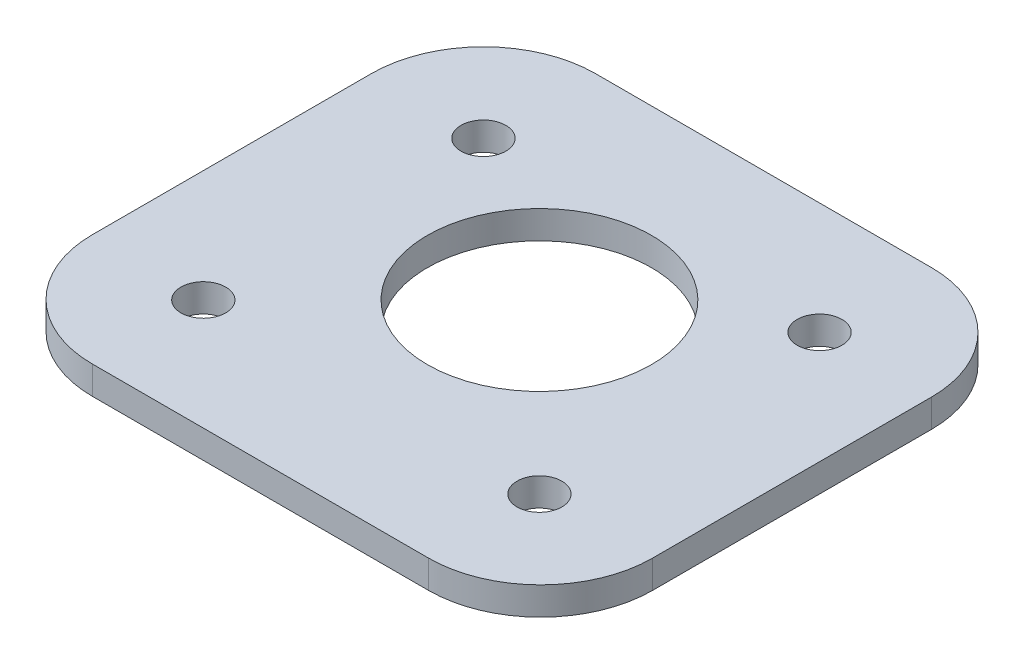
ISO-10303-21;
HEADER;
FILE_DESCRIPTION(('STEP AP214'),'2;1');
FILE_NAME('part.step','',(''),(''),'','','');
FILE_SCHEMA(('AUTOMOTIVE_DESIGN { 1 0 10303 214 1 1 1 1 }'));
ENDSEC;
DATA;
#1=APPLICATION_CONTEXT('core data for automotive mechanical design processes');
#2=APPLICATION_PROTOCOL_DEFINITION('international standard','automotive_design',2000,#1);
#3=PRODUCT_CONTEXT('',#1,'mechanical');
#4=PRODUCT('Part','Part','',(#3));
#5=PRODUCT_RELATED_PRODUCT_CATEGORY('part','',(#4));
#6=PRODUCT_DEFINITION_FORMATION('','',#4);
#7=PRODUCT_DEFINITION_CONTEXT('part definition',#1,'design');
#8=PRODUCT_DEFINITION('design','',#6,#7);
#9=PRODUCT_DEFINITION_SHAPE('','',#8);
#10=(LENGTH_UNIT() NAMED_UNIT(*) SI_UNIT(.MILLI.,.METRE.));
#11=(NAMED_UNIT(*) PLANE_ANGLE_UNIT() SI_UNIT($,.RADIAN.));
#12=(NAMED_UNIT(*) SI_UNIT($,.STERADIAN.) SOLID_ANGLE_UNIT());
#13=UNCERTAINTY_MEASURE_WITH_UNIT(LENGTH_MEASURE(1.E-05),#10,'distance_accuracy_value','');
#14=(GEOMETRIC_REPRESENTATION_CONTEXT(3) GLOBAL_UNCERTAINTY_ASSIGNED_CONTEXT((#13)) GLOBAL_UNIT_ASSIGNED_CONTEXT((#10,
#11,#12)) REPRESENTATION_CONTEXT('',''));
#15=CARTESIAN_POINT('',(0.,0.,0.));
#16=DIRECTION('',(0.,0.,1.));
#17=DIRECTION('',(1.,0.,0.));
#18=AXIS2_PLACEMENT_3D('',#15,#16,#17);
#19=CARTESIAN_POINT('',(63.5,9.525,0.));
#20=DIRECTION('',(1.,0.,0.));
#21=DIRECTION('',(0.,0.,-1.));
#22=AXIS2_PLACEMENT_3D('',#19,#20,#21);
#23=PLANE('',#22);
#24=DIRECTION('',(0.,-1.,0.));
#25=VECTOR('',#24,1.);
#26=CARTESIAN_POINT('',(63.5,9.525,9.7090579710145));
#27=LINE('',#26,#25);
#28=CARTESIAN_POINT('',(63.5,0.,9.7090579710145));
#29=VERTEX_POINT('',#28);
#30=CARTESIAN_POINT('',(63.5,3.175,9.7090579710145));
#31=VERTEX_POINT('',#30);
#32=EDGE_CURVE('E135',#29,#31,#27,.F.);
#33=ORIENTED_EDGE('',*,*,#32,.T.);
#34=DIRECTION('',(0.,0.,-1.));
#35=VECTOR('',#34,1.);
#36=CARTESIAN_POINT('',(63.5,3.175,41.3320579710145));
#37=LINE('',#36,#35);
#38=CARTESIAN_POINT('',(63.5,3.175,41.3320579710145));
#39=VERTEX_POINT('',#38);
#40=EDGE_CURVE('E188',#39,#31,#37,.T.);
#41=ORIENTED_EDGE('',*,*,#40,.F.);
#42=DIRECTION('',(0.,-1.,0.));
#43=VECTOR('',#42,1.);
#44=CARTESIAN_POINT('',(63.5,9.525,41.3320579710145));
#45=LINE('',#44,#43);
#46=CARTESIAN_POINT('',(63.5,0.,41.3320579710145));
#47=VERTEX_POINT('',#46);
#48=EDGE_CURVE('E128',#39,#47,#45,.T.);
#49=ORIENTED_EDGE('',*,*,#48,.T.);
#50=DIRECTION('',(0.,0.,1.));
#51=VECTOR('',#50,1.);
#52=CARTESIAN_POINT('',(63.5,0.,0.));
#53=LINE('',#52,#51);
#54=EDGE_CURVE('E146',#29,#47,#53,.T.);
#55=ORIENTED_EDGE('',*,*,#54,.F.);
#56=EDGE_LOOP('',(#33,#41,#49,#55));
#57=FACE_BOUND('',#56,.T.);
#58=ADVANCED_FACE('F40',(#57),#23,.T.);
#59=CARTESIAN_POINT('',(0.,9.525,0.));
#60=DIRECTION('',(1.,0.,0.));
#61=DIRECTION('',(0.,0.,-1.));
#62=AXIS2_PLACEMENT_3D('',#59,#60,#61);
#63=PLANE('',#62);
#64=DIRECTION('',(0.,0.,1.));
#65=VECTOR('',#64,1.);
#66=CARTESIAN_POINT('',(0.,3.175,9.7090579710145));
#67=LINE('',#66,#65);
#68=CARTESIAN_POINT('',(0.,3.175,9.7090579710145));
#69=VERTEX_POINT('',#68);
#70=CARTESIAN_POINT('',(0.,3.175,41.3320579710145));
#71=VERTEX_POINT('',#70);
#72=EDGE_CURVE('E55',#69,#71,#67,.T.);
#73=ORIENTED_EDGE('',*,*,#72,.F.);
#74=DIRECTION('',(0.,-1.,0.));
#75=VECTOR('',#74,1.);
#76=CARTESIAN_POINT('',(0.,0.,9.7090579710145));
#77=LINE('',#76,#75);
#78=CARTESIAN_POINT('',(0.,0.,9.7090579710145));
#79=VERTEX_POINT('',#78);
#80=EDGE_CURVE('E138',#69,#79,#77,.T.);
#81=ORIENTED_EDGE('',*,*,#80,.T.);
#82=DIRECTION('',(0.,0.,1.));
#83=VECTOR('',#82,1.);
#84=CARTESIAN_POINT('',(0.,0.,0.));
#85=LINE('',#84,#83);
#86=CARTESIAN_POINT('',(0.,0.,41.3320579710145));
#87=VERTEX_POINT('',#86);
#88=EDGE_CURVE('E144',#79,#87,#85,.T.);
#89=ORIENTED_EDGE('',*,*,#88,.T.);
#90=DIRECTION('',(0.,1.,0.));
#91=VECTOR('',#90,1.);
#92=CARTESIAN_POINT('',(0.,9.525,41.3320579710145));
#93=LINE('',#92,#91);
#94=EDGE_CURVE('E11',#87,#71,#93,.T.);
#95=ORIENTED_EDGE('',*,*,#94,.T.);
#96=EDGE_LOOP('',(#73,#81,#89,#95));
#97=FACE_BOUND('',#96,.T.);
#98=ADVANCED_FACE('F206',(#97),#63,.F.);
#99=CARTESIAN_POINT('',(0.,9.525,-2.99094202898549));
#100=DIRECTION('',(0.,0.,-1.));
#101=DIRECTION('',(-1.,0.,0.));
#102=AXIS2_PLACEMENT_3D('',#99,#100,#101);
#103=PLANE('',#102);
#104=DIRECTION('',(0.,-1.,0.));
#105=VECTOR('',#104,1.);
#106=CARTESIAN_POINT('',(12.7,9.525,-2.99094202898549));
#107=LINE('',#106,#105);
#108=CARTESIAN_POINT('',(12.7,0.,-2.99094202898549));
#109=VERTEX_POINT('',#108);
#110=CARTESIAN_POINT('',(12.7,3.175,-2.99094202898549));
#111=VERTEX_POINT('',#110);
#112=EDGE_CURVE('E130',#109,#111,#107,.F.);
#113=ORIENTED_EDGE('',*,*,#112,.T.);
#114=DIRECTION('',(-1.,0.,0.));
#115=VECTOR('',#114,1.);
#116=CARTESIAN_POINT('',(50.8,3.175,-2.99094202898549));
#117=LINE('',#116,#115);
#118=CARTESIAN_POINT('',(50.8,3.175,-2.99094202898549));
#119=VERTEX_POINT('',#118);
#120=EDGE_CURVE('E184',#119,#111,#117,.T.);
#121=ORIENTED_EDGE('',*,*,#120,.F.);
#122=DIRECTION('',(0.,-1.,0.));
#123=VECTOR('',#122,1.);
#124=CARTESIAN_POINT('',(50.8,9.525,-2.99094202898549));
#125=LINE('',#124,#123);
#126=CARTESIAN_POINT('',(50.8,0.,-2.99094202898549));
#127=VERTEX_POINT('',#126);
#128=EDGE_CURVE('E133',#119,#127,#125,.T.);
#129=ORIENTED_EDGE('',*,*,#128,.T.);
#130=DIRECTION('',(1.,0.,0.));
#131=VECTOR('',#130,1.);
#132=CARTESIAN_POINT('',(0.,0.,-2.99094202898549));
#133=LINE('',#132,#131);
#134=EDGE_CURVE('E149',#109,#127,#133,.T.);
#135=ORIENTED_EDGE('',*,*,#134,.F.);
#136=EDGE_LOOP('',(#113,#121,#129,#135));
#137=FACE_BOUND('',#136,.T.);
#138=ADVANCED_FACE('F212',(#137),#103,.T.);
#139=CARTESIAN_POINT('',(12.7,9.525,9.7090579710145));
#140=DIRECTION('',(0.,1.,0.));
#141=DIRECTION('',(0.,0.,1.));
#142=AXIS2_PLACEMENT_3D('',#139,#140,#141);
#143=CYLINDRICAL_SURFACE('',#142,12.7);
#144=ORIENTED_EDGE('',*,*,#80,.F.);
#145=CARTESIAN_POINT('',(12.7,3.175,9.7090579710145));
#146=DIRECTION('',(0.,1.,0.));
#147=DIRECTION('',(0.,0.,1.));
#148=AXIS2_PLACEMENT_3D('',#145,#146,#147);
#149=CIRCLE('',#148,12.7);
#150=EDGE_CURVE('E182',#111,#69,#149,.T.);
#151=ORIENTED_EDGE('',*,*,#150,.F.);
#152=ORIENTED_EDGE('',*,*,#112,.F.);
#153=CARTESIAN_POINT('',(12.7,0.,9.7090579710145));
#154=DIRECTION('',(0.,1.,0.));
#155=DIRECTION('',(0.,0.,1.));
#156=AXIS2_PLACEMENT_3D('',#153,#154,#155);
#157=CIRCLE('',#156,12.7);
#158=EDGE_CURVE('E140',#79,#109,#157,.F.);
#159=ORIENTED_EDGE('',*,*,#158,.F.);
#160=EDGE_LOOP('',(#144,#151,#152,#159));
#161=FACE_BOUND('',#160,.T.);
#162=ADVANCED_FACE('F216',(#161),#143,.T.);
#163=CARTESIAN_POINT('',(50.8,9.525,9.7090579710145));
#164=DIRECTION('',(0.,-1.,0.));
#165=DIRECTION('',(0.,0.,-1.));
#166=AXIS2_PLACEMENT_3D('',#163,#164,#165);
#167=CYLINDRICAL_SURFACE('',#166,12.7);
#168=ORIENTED_EDGE('',*,*,#128,.F.);
#169=CARTESIAN_POINT('',(50.8,3.175,9.7090579710145));
#170=DIRECTION('',(0.,1.,0.));
#171=DIRECTION('',(0.,0.,1.));
#172=AXIS2_PLACEMENT_3D('',#169,#170,#171);
#173=CIRCLE('',#172,12.7);
#174=EDGE_CURVE('E186',#31,#119,#173,.T.);
#175=ORIENTED_EDGE('',*,*,#174,.F.);
#176=ORIENTED_EDGE('',*,*,#32,.F.);
#177=CARTESIAN_POINT('',(50.8,0.,9.7090579710145));
#178=DIRECTION('',(0.,1.,0.));
#179=DIRECTION('',(0.,0.,1.));
#180=AXIS2_PLACEMENT_3D('',#177,#178,#179);
#181=CIRCLE('',#180,12.7);
#182=EDGE_CURVE('E142',#127,#29,#181,.F.);
#183=ORIENTED_EDGE('',*,*,#182,.F.);
#184=EDGE_LOOP('',(#168,#175,#176,#183));
#185=FACE_BOUND('',#184,.T.);
#186=ADVANCED_FACE('F219',(#185),#167,.T.);
#187=CARTESIAN_POINT('',(12.7,9.525,41.4590579710145));
#188=DIRECTION('',(0.,-1.,0.));
#189=DIRECTION('',(0.,0.,-1.));
#190=AXIS2_PLACEMENT_3D('',#187,#188,#189);
#191=CYLINDRICAL_SURFACE('',#190,2.54);
#192=CARTESIAN_POINT('',(12.7,0.,41.4590579710145));
#193=DIRECTION('',(0.,-1.,0.));
#194=DIRECTION('',(0.,0.,-1.));
#195=AXIS2_PLACEMENT_3D('',#192,#193,#194);
#196=CIRCLE('',#195,2.54);
#197=CARTESIAN_POINT('',(12.7,0.,38.9190579710145));
#198=VERTEX_POINT('',#197);
#199=EDGE_CURVE('E152',#198,#198,#196,.T.);
#200=CARTESIAN_POINT('',(12.7,3.175,41.4590579710145));
#201=DIRECTION('',(0.,1.,0.));
#202=DIRECTION('',(0.,0.,1.));
#203=AXIS2_PLACEMENT_3D('',#200,#201,#202);
#204=CIRCLE('',#203,2.54);
#205=CARTESIAN_POINT('',(12.7,3.175,38.9190579710145));
#206=VERTEX_POINT('',#205);
#207=EDGE_CURVE('E169',#206,#206,#204,.F.);
#208=CARTESIAN_POINT('',(12.7,0.,38.9190579710145));
#209=CARTESIAN_POINT('',(12.7,0.0330729166666665,38.9190579710145));
#210=CARTESIAN_POINT('',(12.7,0.066145833333333,38.9190579710145));
#211=CARTESIAN_POINT('',(12.7,0.132291666666667,38.9190579710145));
#212=CARTESIAN_POINT('',(12.7,0.165364583333334,38.9190579710145));
#213=CARTESIAN_POINT('',(12.7,0.231510416666667,38.9190579710145));
#214=CARTESIAN_POINT('',(12.7,0.264583333333334,38.9190579710145));
#215=CARTESIAN_POINT('',(12.7,0.330729166666667,38.9190579710145));
#216=CARTESIAN_POINT('',(12.7,0.363802083333333,38.9190579710145));
#217=CARTESIAN_POINT('',(12.7,0.429947916666667,38.9190579710145));
#218=CARTESIAN_POINT('',(12.7,0.463020833333334,38.9190579710145));
#219=CARTESIAN_POINT('',(12.7,0.529166666666667,38.9190579710145));
#220=CARTESIAN_POINT('',(12.7,0.562239583333334,38.9190579710145));
#221=CARTESIAN_POINT('',(12.7,0.628385416666667,38.9190579710145));
#222=CARTESIAN_POINT('',(12.7,0.661458333333333,38.9190579710145));
#223=CARTESIAN_POINT('',(12.7,0.727604166666666,38.9190579710145));
#224=CARTESIAN_POINT('',(12.7,0.760677083333333,38.9190579710145));
#225=CARTESIAN_POINT('',(12.7,0.826822916666666,38.9190579710145));
#226=CARTESIAN_POINT('',(12.7,0.859895833333334,38.9190579710145));
#227=CARTESIAN_POINT('',(12.7,0.926041666666667,38.9190579710145));
#228=CARTESIAN_POINT('',(12.7,0.959114583333334,38.9190579710145));
#229=CARTESIAN_POINT('',(12.7,1.02526041666667,38.9190579710145));
#230=CARTESIAN_POINT('',(12.7,1.05833333333333,38.9190579710145));
#231=CARTESIAN_POINT('',(12.7,1.12447916666667,38.9190579710145));
#232=CARTESIAN_POINT('',(12.7,1.15755208333333,38.9190579710145));
#233=CARTESIAN_POINT('',(12.7,1.22369791666667,38.9190579710145));
#234=CARTESIAN_POINT('',(12.7,1.25677083333333,38.9190579710145));
#235=CARTESIAN_POINT('',(12.7,1.32291666666667,38.9190579710145));
#236=CARTESIAN_POINT('',(12.7,1.35598958333333,38.9190579710145));
#237=CARTESIAN_POINT('',(12.7,1.42213541666667,38.9190579710145));
#238=CARTESIAN_POINT('',(12.7,1.45520833333333,38.9190579710145));
#239=CARTESIAN_POINT('',(12.7,1.52135416666667,38.9190579710145));
#240=CARTESIAN_POINT('',(12.7,1.55442708333333,38.9190579710145));
#241=CARTESIAN_POINT('',(12.7,1.62057291666667,38.9190579710145));
#242=CARTESIAN_POINT('',(12.7,1.65364583333333,38.9190579710145));
#243=CARTESIAN_POINT('',(12.7,1.71979166666667,38.9190579710145));
#244=CARTESIAN_POINT('',(12.7,1.75286458333333,38.9190579710145));
#245=CARTESIAN_POINT('',(12.7,1.81901041666667,38.9190579710145));
#246=CARTESIAN_POINT('',(12.7,1.85208333333333,38.9190579710145));
#247=CARTESIAN_POINT('',(12.7,1.91822916666667,38.9190579710145));
#248=CARTESIAN_POINT('',(12.7,1.95130208333333,38.9190579710145));
#249=CARTESIAN_POINT('',(12.7,2.01744791666667,38.9190579710145));
#250=CARTESIAN_POINT('',(12.7,2.05052083333333,38.9190579710145));
#251=CARTESIAN_POINT('',(12.7,2.11666666666667,38.9190579710145));
#252=CARTESIAN_POINT('',(12.7,2.14973958333333,38.9190579710145));
#253=CARTESIAN_POINT('',(12.7,2.21588541666667,38.9190579710145));
#254=CARTESIAN_POINT('',(12.7,2.24895833333333,38.9190579710145));
#255=CARTESIAN_POINT('',(12.7,2.31510416666667,38.9190579710145));
#256=CARTESIAN_POINT('',(12.7,2.34817708333333,38.9190579710145));
#257=CARTESIAN_POINT('',(12.7,2.41432291666667,38.9190579710145));
#258=CARTESIAN_POINT('',(12.7,2.44739583333333,38.9190579710145));
#259=CARTESIAN_POINT('',(12.7,2.51354166666667,38.9190579710145));
#260=CARTESIAN_POINT('',(12.7,2.54661458333333,38.9190579710145));
#261=CARTESIAN_POINT('',(12.7,2.61276041666667,38.9190579710145));
#262=CARTESIAN_POINT('',(12.7,2.64583333333333,38.9190579710145));
#263=CARTESIAN_POINT('',(12.7,2.71197916666667,38.9190579710145));
#264=CARTESIAN_POINT('',(12.7,2.74505208333333,38.9190579710145));
#265=CARTESIAN_POINT('',(12.7,2.81119791666667,38.9190579710145));
#266=CARTESIAN_POINT('',(12.7,2.84427083333333,38.9190579710145));
#267=CARTESIAN_POINT('',(12.7,2.91041666666667,38.9190579710145));
#268=CARTESIAN_POINT('',(12.7,2.94348958333333,38.9190579710145));
#269=CARTESIAN_POINT('',(12.7,3.00963541666667,38.9190579710145));
#270=CARTESIAN_POINT('',(12.7,3.04270833333333,38.9190579710145));
#271=CARTESIAN_POINT('',(12.7,3.10885416666667,38.9190579710145));
#272=CARTESIAN_POINT('',(12.7,3.14192708333333,38.9190579710145));
#273=CARTESIAN_POINT('',(12.7,3.175,38.9190579710145));
#274=B_SPLINE_CURVE_WITH_KNOTS('',3,(#208,#209,#210,#211,#212,#213,#214,#215,#216,#217,#218,
#219,#220,#221,#222,#223,#224,#225,#226,#227,#228,#229,#230,#231,#232,#233,#234,#235,#236,#237,
#238,#239,#240,#241,#242,#243,#244,#245,#246,#247,#248,#249,#250,#251,#252,#253,#254,#255,#256,
#257,#258,#259,#260,#261,#262,#263,#264,#265,#266,#267,#268,#269,#270,#271,#272,#273),
.UNSPECIFIED.,.F.,.F.,(4,2,2,2,2,2,2,2,2,2,2,2,2,2,2,2,2,2,2,2,2,2,2,2,2,2,2,2,2,2,2,2,4),(0.,
0.0992187499999995,0.198437500000001,0.29765625,0.396875,0.496093750000001,0.5953125,0.69453125,
0.793749999999999,0.892968750000001,0.9921875,1.09140625,1.190625,1.28984375,1.3890625,
1.48828125,1.5875,1.68671875,1.7859375,1.88515625,1.984375,2.08359375,2.1828125,2.28203125,
2.38125,2.48046875,2.5796875,2.67890625,2.778125,2.87734375,2.9765625,3.07578125,3.175),.UNSPECIFIED.);
#275=EDGE_CURVE('BSEAM222',#198,#206,#274,.T.);
#276=ORIENTED_EDGE('',*,*,#199,.T.);
#277=ORIENTED_EDGE('',*,*,#207,.F.);
#278=ORIENTED_EDGE('',*,*,#275,.T.);
#279=ORIENTED_EDGE('',*,*,#275,.F.);
#280=EDGE_LOOP('',(#276,#278,#277,#279));
#281=FACE_BOUND('',#280,.T.);
#282=ADVANCED_FACE('F222',(#281),#191,.F.);
#283=CARTESIAN_POINT('',(50.8,9.525,41.4590579710145));
#284=DIRECTION('',(0.,-1.,0.));
#285=DIRECTION('',(0.,0.,-1.));
#286=AXIS2_PLACEMENT_3D('',#283,#284,#285);
#287=CYLINDRICAL_SURFACE('',#286,2.54);
#288=CARTESIAN_POINT('',(50.8,0.,41.4590579710145));
#289=DIRECTION('',(0.,-1.,0.));
#290=DIRECTION('',(0.,0.,-1.));
#291=AXIS2_PLACEMENT_3D('',#288,#289,#290);
#292=CIRCLE('',#291,2.54);
#293=CARTESIAN_POINT('',(50.8,0.,38.9190579710145));
#294=VERTEX_POINT('',#293);
#295=EDGE_CURVE('E155',#294,#294,#292,.T.);
#296=CARTESIAN_POINT('',(50.8,3.175,41.4590579710145));
#297=DIRECTION('',(0.,1.,0.));
#298=DIRECTION('',(0.,0.,1.));
#299=AXIS2_PLACEMENT_3D('',#296,#297,#298);
#300=CIRCLE('',#299,2.54);
#301=CARTESIAN_POINT('',(50.8,3.175,38.9190579710145));
#302=VERTEX_POINT('',#301);
#303=EDGE_CURVE('E172',#302,#302,#300,.F.);
#304=CARTESIAN_POINT('',(50.8,0.,38.9190579710145));
#305=CARTESIAN_POINT('',(50.8,0.0330729166666665,38.9190579710145));
#306=CARTESIAN_POINT('',(50.8,0.066145833333333,38.9190579710145));
#307=CARTESIAN_POINT('',(50.8,0.132291666666667,38.9190579710145));
#308=CARTESIAN_POINT('',(50.8,0.165364583333334,38.9190579710145));
#309=CARTESIAN_POINT('',(50.8,0.231510416666667,38.9190579710145));
#310=CARTESIAN_POINT('',(50.8,0.264583333333334,38.9190579710145));
#311=CARTESIAN_POINT('',(50.8,0.330729166666667,38.9190579710145));
#312=CARTESIAN_POINT('',(50.8,0.363802083333333,38.9190579710145));
#313=CARTESIAN_POINT('',(50.8,0.429947916666667,38.9190579710145));
#314=CARTESIAN_POINT('',(50.8,0.463020833333334,38.9190579710145));
#315=CARTESIAN_POINT('',(50.8,0.529166666666667,38.9190579710145));
#316=CARTESIAN_POINT('',(50.8,0.562239583333334,38.9190579710145));
#317=CARTESIAN_POINT('',(50.8,0.628385416666667,38.9190579710145));
#318=CARTESIAN_POINT('',(50.8,0.661458333333333,38.9190579710145));
#319=CARTESIAN_POINT('',(50.8,0.727604166666666,38.9190579710145));
#320=CARTESIAN_POINT('',(50.8,0.760677083333333,38.9190579710145));
#321=CARTESIAN_POINT('',(50.8,0.826822916666666,38.9190579710145));
#322=CARTESIAN_POINT('',(50.8,0.859895833333334,38.9190579710145));
#323=CARTESIAN_POINT('',(50.8,0.926041666666667,38.9190579710145));
#324=CARTESIAN_POINT('',(50.8,0.959114583333334,38.9190579710145));
#325=CARTESIAN_POINT('',(50.8,1.02526041666667,38.9190579710145));
#326=CARTESIAN_POINT('',(50.8,1.05833333333333,38.9190579710145));
#327=CARTESIAN_POINT('',(50.8,1.12447916666667,38.9190579710145));
#328=CARTESIAN_POINT('',(50.8,1.15755208333333,38.9190579710145));
#329=CARTESIAN_POINT('',(50.8,1.22369791666667,38.9190579710145));
#330=CARTESIAN_POINT('',(50.8,1.25677083333333,38.9190579710145));
#331=CARTESIAN_POINT('',(50.8,1.32291666666667,38.9190579710145));
#332=CARTESIAN_POINT('',(50.8,1.35598958333333,38.9190579710145));
#333=CARTESIAN_POINT('',(50.8,1.42213541666667,38.9190579710145));
#334=CARTESIAN_POINT('',(50.8,1.45520833333333,38.9190579710145));
#335=CARTESIAN_POINT('',(50.8,1.52135416666667,38.9190579710145));
#336=CARTESIAN_POINT('',(50.8,1.55442708333333,38.9190579710145));
#337=CARTESIAN_POINT('',(50.8,1.62057291666667,38.9190579710145));
#338=CARTESIAN_POINT('',(50.8,1.65364583333333,38.9190579710145));
#339=CARTESIAN_POINT('',(50.8,1.71979166666667,38.9190579710145));
#340=CARTESIAN_POINT('',(50.8,1.75286458333333,38.9190579710145));
#341=CARTESIAN_POINT('',(50.8,1.81901041666667,38.9190579710145));
#342=CARTESIAN_POINT('',(50.8,1.85208333333333,38.9190579710145));
#343=CARTESIAN_POINT('',(50.8,1.91822916666667,38.9190579710145));
#344=CARTESIAN_POINT('',(50.8,1.95130208333333,38.9190579710145));
#345=CARTESIAN_POINT('',(50.8,2.01744791666667,38.9190579710145));
#346=CARTESIAN_POINT('',(50.8,2.05052083333333,38.9190579710145));
#347=CARTESIAN_POINT('',(50.8,2.11666666666667,38.9190579710145));
#348=CARTESIAN_POINT('',(50.8,2.14973958333333,38.9190579710145));
#349=CARTESIAN_POINT('',(50.8,2.21588541666667,38.9190579710145));
#350=CARTESIAN_POINT('',(50.8,2.24895833333333,38.9190579710145));
#351=CARTESIAN_POINT('',(50.8,2.31510416666667,38.9190579710145));
#352=CARTESIAN_POINT('',(50.8,2.34817708333333,38.9190579710145));
#353=CARTESIAN_POINT('',(50.8,2.41432291666667,38.9190579710145));
#354=CARTESIAN_POINT('',(50.8,2.44739583333333,38.9190579710145));
#355=CARTESIAN_POINT('',(50.8,2.51354166666667,38.9190579710145));
#356=CARTESIAN_POINT('',(50.8,2.54661458333333,38.9190579710145));
#357=CARTESIAN_POINT('',(50.8,2.61276041666667,38.9190579710145));
#358=CARTESIAN_POINT('',(50.8,2.64583333333333,38.9190579710145));
#359=CARTESIAN_POINT('',(50.8,2.71197916666667,38.9190579710145));
#360=CARTESIAN_POINT('',(50.8,2.74505208333333,38.9190579710145));
#361=CARTESIAN_POINT('',(50.8,2.81119791666667,38.9190579710145));
#362=CARTESIAN_POINT('',(50.8,2.84427083333333,38.9190579710145));
#363=CARTESIAN_POINT('',(50.8,2.91041666666667,38.9190579710145));
#364=CARTESIAN_POINT('',(50.8,2.94348958333333,38.9190579710145));
#365=CARTESIAN_POINT('',(50.8,3.00963541666667,38.9190579710145));
#366=CARTESIAN_POINT('',(50.8,3.04270833333333,38.9190579710145));
#367=CARTESIAN_POINT('',(50.8,3.10885416666667,38.9190579710145));
#368=CARTESIAN_POINT('',(50.8,3.14192708333333,38.9190579710145));
#369=CARTESIAN_POINT('',(50.8,3.175,38.9190579710145));
#370=B_SPLINE_CURVE_WITH_KNOTS('',3,(#304,#305,#306,#307,#308,#309,#310,#311,#312,#313,#314,
#315,#316,#317,#318,#319,#320,#321,#322,#323,#324,#325,#326,#327,#328,#329,#330,#331,#332,#333,
#334,#335,#336,#337,#338,#339,#340,#341,#342,#343,#344,#345,#346,#347,#348,#349,#350,#351,#352,
#353,#354,#355,#356,#357,#358,#359,#360,#361,#362,#363,#364,#365,#366,#367,#368,#369),
.UNSPECIFIED.,.F.,.F.,(4,2,2,2,2,2,2,2,2,2,2,2,2,2,2,2,2,2,2,2,2,2,2,2,2,2,2,2,2,2,2,2,4),(0.,
0.0992187499999995,0.198437500000001,0.29765625,0.396875,0.496093750000001,0.5953125,0.69453125,
0.793749999999999,0.892968750000001,0.9921875,1.09140625,1.190625,1.28984375,1.3890625,
1.48828125,1.5875,1.68671875,1.7859375,1.88515625,1.984375,2.08359375,2.1828125,2.28203125,
2.38125,2.48046875,2.5796875,2.67890625,2.778125,2.87734375,2.9765625,3.07578125,3.175),.UNSPECIFIED.);
#371=EDGE_CURVE('BSEAM255',#294,#302,#370,.T.);
#372=ORIENTED_EDGE('',*,*,#295,.T.);
#373=ORIENTED_EDGE('',*,*,#303,.F.);
#374=ORIENTED_EDGE('',*,*,#371,.T.);
#375=ORIENTED_EDGE('',*,*,#371,.F.);
#376=EDGE_LOOP('',(#372,#374,#373,#375));
#377=FACE_BOUND('',#376,.T.);
#378=ADVANCED_FACE('F255',(#377),#287,.F.);
#379=CARTESIAN_POINT('',(50.8,9.525,9.7090579710145));
#380=DIRECTION('',(0.,-1.,0.));
#381=DIRECTION('',(0.,0.,-1.));
#382=AXIS2_PLACEMENT_3D('',#379,#380,#381);
#383=CYLINDRICAL_SURFACE('',#382,2.54);
#384=CARTESIAN_POINT('',(50.8,0.,9.7090579710145));
#385=DIRECTION('',(0.,-1.,0.));
#386=DIRECTION('',(0.,0.,-1.));
#387=AXIS2_PLACEMENT_3D('',#384,#385,#386);
#388=CIRCLE('',#387,2.54);
#389=CARTESIAN_POINT('',(50.8,0.,7.1690579710145));
#390=VERTEX_POINT('',#389);
#391=EDGE_CURVE('E159',#390,#390,#388,.T.);
#392=CARTESIAN_POINT('',(50.8,3.175,9.7090579710145));
#393=DIRECTION('',(0.,1.,0.));
#394=DIRECTION('',(0.,0.,1.));
#395=AXIS2_PLACEMENT_3D('',#392,#393,#394);
#396=CIRCLE('',#395,2.54);
#397=CARTESIAN_POINT('',(50.8,3.175,7.1690579710145));
#398=VERTEX_POINT('',#397);
#399=EDGE_CURVE('E175',#398,#398,#396,.F.);
#400=CARTESIAN_POINT('',(50.8,0.,7.1690579710145));
#401=CARTESIAN_POINT('',(50.8,0.0330729166666665,7.1690579710145));
#402=CARTESIAN_POINT('',(50.8,0.066145833333333,7.1690579710145));
#403=CARTESIAN_POINT('',(50.8,0.132291666666667,7.1690579710145));
#404=CARTESIAN_POINT('',(50.8,0.165364583333334,7.1690579710145));
#405=CARTESIAN_POINT('',(50.8,0.231510416666667,7.1690579710145));
#406=CARTESIAN_POINT('',(50.8,0.264583333333334,7.1690579710145));
#407=CARTESIAN_POINT('',(50.8,0.330729166666667,7.1690579710145));
#408=CARTESIAN_POINT('',(50.8,0.363802083333333,7.1690579710145));
#409=CARTESIAN_POINT('',(50.8,0.429947916666667,7.1690579710145));
#410=CARTESIAN_POINT('',(50.8,0.463020833333334,7.1690579710145));
#411=CARTESIAN_POINT('',(50.8,0.529166666666667,7.1690579710145));
#412=CARTESIAN_POINT('',(50.8,0.562239583333334,7.1690579710145));
#413=CARTESIAN_POINT('',(50.8,0.628385416666667,7.1690579710145));
#414=CARTESIAN_POINT('',(50.8,0.661458333333333,7.1690579710145));
#415=CARTESIAN_POINT('',(50.8,0.727604166666666,7.1690579710145));
#416=CARTESIAN_POINT('',(50.8,0.760677083333333,7.1690579710145));
#417=CARTESIAN_POINT('',(50.8,0.826822916666666,7.1690579710145));
#418=CARTESIAN_POINT('',(50.8,0.859895833333334,7.1690579710145));
#419=CARTESIAN_POINT('',(50.8,0.926041666666667,7.1690579710145));
#420=CARTESIAN_POINT('',(50.8,0.959114583333334,7.1690579710145));
#421=CARTESIAN_POINT('',(50.8,1.02526041666667,7.1690579710145));
#422=CARTESIAN_POINT('',(50.8,1.05833333333333,7.1690579710145));
#423=CARTESIAN_POINT('',(50.8,1.12447916666667,7.1690579710145));
#424=CARTESIAN_POINT('',(50.8,1.15755208333333,7.1690579710145));
#425=CARTESIAN_POINT('',(50.8,1.22369791666667,7.1690579710145));
#426=CARTESIAN_POINT('',(50.8,1.25677083333333,7.1690579710145));
#427=CARTESIAN_POINT('',(50.8,1.32291666666667,7.1690579710145));
#428=CARTESIAN_POINT('',(50.8,1.35598958333333,7.1690579710145));
#429=CARTESIAN_POINT('',(50.8,1.42213541666667,7.1690579710145));
#430=CARTESIAN_POINT('',(50.8,1.45520833333333,7.1690579710145));
#431=CARTESIAN_POINT('',(50.8,1.52135416666667,7.1690579710145));
#432=CARTESIAN_POINT('',(50.8,1.55442708333333,7.1690579710145));
#433=CARTESIAN_POINT('',(50.8,1.62057291666667,7.1690579710145));
#434=CARTESIAN_POINT('',(50.8,1.65364583333333,7.1690579710145));
#435=CARTESIAN_POINT('',(50.8,1.71979166666667,7.1690579710145));
#436=CARTESIAN_POINT('',(50.8,1.75286458333333,7.1690579710145));
#437=CARTESIAN_POINT('',(50.8,1.81901041666667,7.1690579710145));
#438=CARTESIAN_POINT('',(50.8,1.85208333333333,7.1690579710145));
#439=CARTESIAN_POINT('',(50.8,1.91822916666667,7.1690579710145));
#440=CARTESIAN_POINT('',(50.8,1.95130208333333,7.1690579710145));
#441=CARTESIAN_POINT('',(50.8,2.01744791666667,7.1690579710145));
#442=CARTESIAN_POINT('',(50.8,2.05052083333333,7.1690579710145));
#443=CARTESIAN_POINT('',(50.8,2.11666666666667,7.1690579710145));
#444=CARTESIAN_POINT('',(50.8,2.14973958333333,7.1690579710145));
#445=CARTESIAN_POINT('',(50.8,2.21588541666667,7.1690579710145));
#446=CARTESIAN_POINT('',(50.8,2.24895833333333,7.1690579710145));
#447=CARTESIAN_POINT('',(50.8,2.31510416666667,7.1690579710145));
#448=CARTESIAN_POINT('',(50.8,2.34817708333333,7.1690579710145));
#449=CARTESIAN_POINT('',(50.8,2.41432291666667,7.1690579710145));
#450=CARTESIAN_POINT('',(50.8,2.44739583333333,7.1690579710145));
#451=CARTESIAN_POINT('',(50.8,2.51354166666667,7.1690579710145));
#452=CARTESIAN_POINT('',(50.8,2.54661458333333,7.1690579710145));
#453=CARTESIAN_POINT('',(50.8,2.61276041666667,7.1690579710145));
#454=CARTESIAN_POINT('',(50.8,2.64583333333333,7.1690579710145));
#455=CARTESIAN_POINT('',(50.8,2.71197916666667,7.1690579710145));
#456=CARTESIAN_POINT('',(50.8,2.74505208333333,7.1690579710145));
#457=CARTESIAN_POINT('',(50.8,2.81119791666667,7.1690579710145));
#458=CARTESIAN_POINT('',(50.8,2.84427083333333,7.1690579710145));
#459=CARTESIAN_POINT('',(50.8,2.91041666666667,7.1690579710145));
#460=CARTESIAN_POINT('',(50.8,2.94348958333333,7.1690579710145));
#461=CARTESIAN_POINT('',(50.8,3.00963541666667,7.1690579710145));
#462=CARTESIAN_POINT('',(50.8,3.04270833333333,7.1690579710145));
#463=CARTESIAN_POINT('',(50.8,3.10885416666667,7.1690579710145));
#464=CARTESIAN_POINT('',(50.8,3.14192708333333,7.1690579710145));
#465=CARTESIAN_POINT('',(50.8,3.175,7.1690579710145));
#466=B_SPLINE_CURVE_WITH_KNOTS('',3,(#400,#401,#402,#403,#404,#405,#406,#407,#408,#409,#410,
#411,#412,#413,#414,#415,#416,#417,#418,#419,#420,#421,#422,#423,#424,#425,#426,#427,#428,#429,
#430,#431,#432,#433,#434,#435,#436,#437,#438,#439,#440,#441,#442,#443,#444,#445,#446,#447,#448,
#449,#450,#451,#452,#453,#454,#455,#456,#457,#458,#459,#460,#461,#462,#463,#464,#465),
.UNSPECIFIED.,.F.,.F.,(4,2,2,2,2,2,2,2,2,2,2,2,2,2,2,2,2,2,2,2,2,2,2,2,2,2,2,2,2,2,2,2,4),(0.,
0.0992187499999995,0.198437500000001,0.29765625,0.396875,0.496093750000001,0.5953125,0.69453125,
0.793749999999999,0.892968750000001,0.9921875,1.09140625,1.190625,1.28984375,1.3890625,
1.48828125,1.5875,1.68671875,1.7859375,1.88515625,1.984375,2.08359375,2.1828125,2.28203125,
2.38125,2.48046875,2.5796875,2.67890625,2.778125,2.87734375,2.9765625,3.07578125,3.175),.UNSPECIFIED.);
#467=EDGE_CURVE('BSEAM258',#390,#398,#466,.T.);
#468=ORIENTED_EDGE('',*,*,#391,.T.);
#469=ORIENTED_EDGE('',*,*,#399,.F.);
#470=ORIENTED_EDGE('',*,*,#467,.T.);
#471=ORIENTED_EDGE('',*,*,#467,.F.);
#472=EDGE_LOOP('',(#468,#470,#469,#471));
#473=FACE_BOUND('',#472,.T.);
#474=ADVANCED_FACE('F258',(#473),#383,.F.);
#475=CARTESIAN_POINT('',(12.7,9.525,9.7090579710145));
#476=DIRECTION('',(0.,-1.,0.));
#477=DIRECTION('',(0.,0.,-1.));
#478=AXIS2_PLACEMENT_3D('',#475,#476,#477);
#479=CYLINDRICAL_SURFACE('',#478,2.54);
#480=CARTESIAN_POINT('',(12.7,0.,9.7090579710145));
#481=DIRECTION('',(0.,-1.,0.));
#482=DIRECTION('',(0.,0.,-1.));
#483=AXIS2_PLACEMENT_3D('',#480,#481,#482);
#484=CIRCLE('',#483,2.54);
#485=CARTESIAN_POINT('',(12.7,0.,7.1690579710145));
#486=VERTEX_POINT('',#485);
#487=EDGE_CURVE('E156',#486,#486,#484,.T.);
#488=CARTESIAN_POINT('',(12.7,3.175,9.7090579710145));
#489=DIRECTION('',(0.,1.,0.));
#490=DIRECTION('',(0.,0.,1.));
#491=AXIS2_PLACEMENT_3D('',#488,#489,#490);
#492=CIRCLE('',#491,2.54);
#493=CARTESIAN_POINT('',(12.7,3.175,7.1690579710145));
#494=VERTEX_POINT('',#493);
#495=EDGE_CURVE('E178',#494,#494,#492,.F.);
#496=CARTESIAN_POINT('',(12.7,0.,7.1690579710145));
#497=CARTESIAN_POINT('',(12.7,0.0330729166666665,7.1690579710145));
#498=CARTESIAN_POINT('',(12.7,0.066145833333333,7.1690579710145));
#499=CARTESIAN_POINT('',(12.7,0.132291666666667,7.1690579710145));
#500=CARTESIAN_POINT('',(12.7,0.165364583333334,7.1690579710145));
#501=CARTESIAN_POINT('',(12.7,0.231510416666667,7.1690579710145));
#502=CARTESIAN_POINT('',(12.7,0.264583333333334,7.1690579710145));
#503=CARTESIAN_POINT('',(12.7,0.330729166666667,7.1690579710145));
#504=CARTESIAN_POINT('',(12.7,0.363802083333333,7.1690579710145));
#505=CARTESIAN_POINT('',(12.7,0.429947916666667,7.1690579710145));
#506=CARTESIAN_POINT('',(12.7,0.463020833333334,7.1690579710145));
#507=CARTESIAN_POINT('',(12.7,0.529166666666667,7.1690579710145));
#508=CARTESIAN_POINT('',(12.7,0.562239583333334,7.1690579710145));
#509=CARTESIAN_POINT('',(12.7,0.628385416666667,7.1690579710145));
#510=CARTESIAN_POINT('',(12.7,0.661458333333333,7.1690579710145));
#511=CARTESIAN_POINT('',(12.7,0.727604166666666,7.1690579710145));
#512=CARTESIAN_POINT('',(12.7,0.760677083333333,7.1690579710145));
#513=CARTESIAN_POINT('',(12.7,0.826822916666666,7.1690579710145));
#514=CARTESIAN_POINT('',(12.7,0.859895833333334,7.1690579710145));
#515=CARTESIAN_POINT('',(12.7,0.926041666666667,7.1690579710145));
#516=CARTESIAN_POINT('',(12.7,0.959114583333334,7.1690579710145));
#517=CARTESIAN_POINT('',(12.7,1.02526041666667,7.1690579710145));
#518=CARTESIAN_POINT('',(12.7,1.05833333333333,7.1690579710145));
#519=CARTESIAN_POINT('',(12.7,1.12447916666667,7.1690579710145));
#520=CARTESIAN_POINT('',(12.7,1.15755208333333,7.1690579710145));
#521=CARTESIAN_POINT('',(12.7,1.22369791666667,7.1690579710145));
#522=CARTESIAN_POINT('',(12.7,1.25677083333333,7.1690579710145));
#523=CARTESIAN_POINT('',(12.7,1.32291666666667,7.1690579710145));
#524=CARTESIAN_POINT('',(12.7,1.35598958333333,7.1690579710145));
#525=CARTESIAN_POINT('',(12.7,1.42213541666667,7.1690579710145));
#526=CARTESIAN_POINT('',(12.7,1.45520833333333,7.1690579710145));
#527=CARTESIAN_POINT('',(12.7,1.52135416666667,7.1690579710145));
#528=CARTESIAN_POINT('',(12.7,1.55442708333333,7.1690579710145));
#529=CARTESIAN_POINT('',(12.7,1.62057291666667,7.1690579710145));
#530=CARTESIAN_POINT('',(12.7,1.65364583333333,7.1690579710145));
#531=CARTESIAN_POINT('',(12.7,1.71979166666667,7.1690579710145));
#532=CARTESIAN_POINT('',(12.7,1.75286458333333,7.1690579710145));
#533=CARTESIAN_POINT('',(12.7,1.81901041666667,7.1690579710145));
#534=CARTESIAN_POINT('',(12.7,1.85208333333333,7.1690579710145));
#535=CARTESIAN_POINT('',(12.7,1.91822916666667,7.1690579710145));
#536=CARTESIAN_POINT('',(12.7,1.95130208333333,7.1690579710145));
#537=CARTESIAN_POINT('',(12.7,2.01744791666667,7.1690579710145));
#538=CARTESIAN_POINT('',(12.7,2.05052083333333,7.1690579710145));
#539=CARTESIAN_POINT('',(12.7,2.11666666666667,7.1690579710145));
#540=CARTESIAN_POINT('',(12.7,2.14973958333333,7.1690579710145));
#541=CARTESIAN_POINT('',(12.7,2.21588541666667,7.1690579710145));
#542=CARTESIAN_POINT('',(12.7,2.24895833333333,7.1690579710145));
#543=CARTESIAN_POINT('',(12.7,2.31510416666667,7.1690579710145));
#544=CARTESIAN_POINT('',(12.7,2.34817708333333,7.1690579710145));
#545=CARTESIAN_POINT('',(12.7,2.41432291666667,7.1690579710145));
#546=CARTESIAN_POINT('',(12.7,2.44739583333333,7.1690579710145));
#547=CARTESIAN_POINT('',(12.7,2.51354166666667,7.1690579710145));
#548=CARTESIAN_POINT('',(12.7,2.54661458333333,7.1690579710145));
#549=CARTESIAN_POINT('',(12.7,2.61276041666667,7.1690579710145));
#550=CARTESIAN_POINT('',(12.7,2.64583333333333,7.1690579710145));
#551=CARTESIAN_POINT('',(12.7,2.71197916666667,7.1690579710145));
#552=CARTESIAN_POINT('',(12.7,2.74505208333333,7.1690579710145));
#553=CARTESIAN_POINT('',(12.7,2.81119791666667,7.1690579710145));
#554=CARTESIAN_POINT('',(12.7,2.84427083333333,7.1690579710145));
#555=CARTESIAN_POINT('',(12.7,2.91041666666667,7.1690579710145));
#556=CARTESIAN_POINT('',(12.7,2.94348958333333,7.1690579710145));
#557=CARTESIAN_POINT('',(12.7,3.00963541666667,7.1690579710145));
#558=CARTESIAN_POINT('',(12.7,3.04270833333333,7.1690579710145));
#559=CARTESIAN_POINT('',(12.7,3.10885416666667,7.1690579710145));
#560=CARTESIAN_POINT('',(12.7,3.14192708333333,7.1690579710145));
#561=CARTESIAN_POINT('',(12.7,3.175,7.1690579710145));
#562=B_SPLINE_CURVE_WITH_KNOTS('',3,(#496,#497,#498,#499,#500,#501,#502,#503,#504,#505,#506,
#507,#508,#509,#510,#511,#512,#513,#514,#515,#516,#517,#518,#519,#520,#521,#522,#523,#524,#525,
#526,#527,#528,#529,#530,#531,#532,#533,#534,#535,#536,#537,#538,#539,#540,#541,#542,#543,#544,
#545,#546,#547,#548,#549,#550,#551,#552,#553,#554,#555,#556,#557,#558,#559,#560,#561),
.UNSPECIFIED.,.F.,.F.,(4,2,2,2,2,2,2,2,2,2,2,2,2,2,2,2,2,2,2,2,2,2,2,2,2,2,2,2,2,2,2,2,4),(0.,
0.0992187499999995,0.198437500000001,0.29765625,0.396875,0.496093750000001,0.5953125,0.69453125,
0.793749999999999,0.892968750000001,0.9921875,1.09140625,1.190625,1.28984375,1.3890625,
1.48828125,1.5875,1.68671875,1.7859375,1.88515625,1.984375,2.08359375,2.1828125,2.28203125,
2.38125,2.48046875,2.5796875,2.67890625,2.778125,2.87734375,2.9765625,3.07578125,3.175),.UNSPECIFIED.);
#563=EDGE_CURVE('BSEAM231',#486,#494,#562,.T.);
#564=ORIENTED_EDGE('',*,*,#487,.T.);
#565=ORIENTED_EDGE('',*,*,#495,.F.);
#566=ORIENTED_EDGE('',*,*,#563,.T.);
#567=ORIENTED_EDGE('',*,*,#563,.F.);
#568=EDGE_LOOP('',(#564,#566,#565,#567));
#569=FACE_BOUND('',#568,.T.);
#570=ADVANCED_FACE('F231',(#569),#479,.F.);
#571=CARTESIAN_POINT('',(0.,0.,54.0320579710145));
#572=DIRECTION('',(0.,0.,1.));
#573=DIRECTION('',(1.,0.,0.));
#574=AXIS2_PLACEMENT_3D('',#571,#572,#573);
#575=PLANE('',#574);
#576=DIRECTION('',(0.,-1.,0.));
#577=VECTOR('',#576,1.);
#578=CARTESIAN_POINT('',(50.8,0.,54.0320579710145));
#579=LINE('',#578,#577);
#580=CARTESIAN_POINT('',(50.8,0.,54.0320579710145));
#581=VERTEX_POINT('',#580);
#582=CARTESIAN_POINT('',(50.8,3.175,54.0320579710145));
#583=VERTEX_POINT('',#582);
#584=EDGE_CURVE('E48',#581,#583,#579,.F.);
#585=ORIENTED_EDGE('',*,*,#584,.T.);
#586=DIRECTION('',(1.,0.,0.));
#587=VECTOR('',#586,1.);
#588=CARTESIAN_POINT('',(12.7,3.175,54.0320579710145));
#589=LINE('',#588,#587);
#590=CARTESIAN_POINT('',(12.7,3.175,54.0320579710145));
#591=VERTEX_POINT('',#590);
#592=EDGE_CURVE('E108',#591,#583,#589,.T.);
#593=ORIENTED_EDGE('',*,*,#592,.F.);
#594=DIRECTION('',(0.,1.,0.));
#595=VECTOR('',#594,1.);
#596=CARTESIAN_POINT('',(12.7,0.,54.0320579710145));
#597=LINE('',#596,#595);
#598=CARTESIAN_POINT('',(12.7,0.,54.0320579710145));
#599=VERTEX_POINT('',#598);
#600=EDGE_CURVE('E119',#591,#599,#597,.F.);
#601=ORIENTED_EDGE('',*,*,#600,.T.);
#602=DIRECTION('',(1.,0.,0.));
#603=VECTOR('',#602,1.);
#604=CARTESIAN_POINT('',(0.,0.,54.0320579710145));
#605=LINE('',#604,#603);
#606=EDGE_CURVE('E160',#599,#581,#605,.T.);
#607=ORIENTED_EDGE('',*,*,#606,.T.);
#608=EDGE_LOOP('',(#585,#593,#601,#607));
#609=FACE_BOUND('',#608,.T.);
#610=ADVANCED_FACE('F117',(#609),#575,.T.);
#611=CARTESIAN_POINT('',(50.8,9.525,41.3320579710145));
#612=DIRECTION('',(0.,-1.,0.));
#613=DIRECTION('',(0.,0.,-1.));
#614=AXIS2_PLACEMENT_3D('',#611,#612,#613);
#615=CYLINDRICAL_SURFACE('',#614,12.7);
#616=ORIENTED_EDGE('',*,*,#48,.F.);
#617=CARTESIAN_POINT('',(50.8,3.175,41.3320579710145));
#618=DIRECTION('',(0.,1.,0.));
#619=DIRECTION('',(0.,0.,1.));
#620=AXIS2_PLACEMENT_3D('',#617,#618,#619);
#621=CIRCLE('',#620,12.7);
#622=EDGE_CURVE('E121',#583,#39,#621,.T.);
#623=ORIENTED_EDGE('',*,*,#622,.F.);
#624=ORIENTED_EDGE('',*,*,#584,.F.);
#625=CARTESIAN_POINT('',(50.8,0.,41.3320579710145));
#626=DIRECTION('',(0.,1.,0.));
#627=DIRECTION('',(0.,0.,1.));
#628=AXIS2_PLACEMENT_3D('',#625,#626,#627);
#629=CIRCLE('',#628,12.7);
#630=EDGE_CURVE('E123',#47,#581,#629,.F.);
#631=ORIENTED_EDGE('',*,*,#630,.F.);
#632=EDGE_LOOP('',(#616,#623,#624,#631));
#633=FACE_BOUND('',#632,.T.);
#634=ADVANCED_FACE('F224',(#633),#615,.T.);
#635=CARTESIAN_POINT('',(12.7,9.525,41.3320579710145));
#636=DIRECTION('',(0.,-1.,0.));
#637=DIRECTION('',(0.,0.,-1.));
#638=AXIS2_PLACEMENT_3D('',#635,#636,#637);
#639=CYLINDRICAL_SURFACE('',#638,12.7);
#640=ORIENTED_EDGE('',*,*,#600,.F.);
#641=CARTESIAN_POINT('',(12.7,3.175,41.3320579710145));
#642=DIRECTION('',(0.,1.,0.));
#643=DIRECTION('',(0.,0.,1.));
#644=AXIS2_PLACEMENT_3D('',#641,#642,#643);
#645=CIRCLE('',#644,12.7);
#646=EDGE_CURVE('E104',#71,#591,#645,.T.);
#647=ORIENTED_EDGE('',*,*,#646,.F.);
#648=ORIENTED_EDGE('',*,*,#94,.F.);
#649=CARTESIAN_POINT('',(12.7,0.,41.3320579710145));
#650=DIRECTION('',(0.,1.,0.));
#651=DIRECTION('',(0.,0.,1.));
#652=AXIS2_PLACEMENT_3D('',#649,#650,#651);
#653=CIRCLE('',#652,12.7);
#654=EDGE_CURVE('E63',#599,#87,#653,.F.);
#655=ORIENTED_EDGE('',*,*,#654,.F.);
#656=EDGE_LOOP('',(#640,#647,#648,#655));
#657=FACE_BOUND('',#656,.T.);
#658=ADVANCED_FACE('F42',(#657),#639,.T.);
#659=CARTESIAN_POINT('',(31.75,-44.9012806053458,22.4090579710145));
#660=DIRECTION('',(0.,1.,0.));
#661=DIRECTION('',(0.,0.,1.));
#662=AXIS2_PLACEMENT_3D('',#659,#660,#661);
#663=CYLINDRICAL_SURFACE('',#662,12.7);
#664=CARTESIAN_POINT('',(31.75,0.,22.4090579710145));
#665=DIRECTION('',(0.,1.,0.));
#666=DIRECTION('',(0.,0.,1.));
#667=AXIS2_PLACEMENT_3D('',#664,#665,#666);
#668=CIRCLE('',#667,12.7);
#669=CARTESIAN_POINT('',(31.75,0.,35.1090579710145));
#670=VERTEX_POINT('',#669);
#671=EDGE_CURVE('E166',#670,#670,#668,.F.);
#672=ORIENTED_EDGE('',*,*,#671,.T.);
#673=EDGE_LOOP('',(#672));
#674=FACE_BOUND('',#673,.T.);
#675=CARTESIAN_POINT('',(31.75,3.175,22.4090579710145));
#676=DIRECTION('',(0.,1.,0.));
#677=DIRECTION('',(0.,0.,1.));
#678=AXIS2_PLACEMENT_3D('',#675,#676,#677);
#679=CIRCLE('',#678,12.7);
#680=CARTESIAN_POINT('',(31.75,3.175,35.1090579710145));
#681=VERTEX_POINT('',#680);
#682=EDGE_CURVE('E113',#681,#681,#679,.T.);
#683=ORIENTED_EDGE('',*,*,#682,.T.);
#684=EDGE_LOOP('',(#683));
#685=FACE_BOUND('',#684,.T.);
#686=ADVANCED_FACE('F194',(#674,#685),#663,.F.);
#687=CARTESIAN_POINT('',(0.,0.,0.));
#688=DIRECTION('',(0.,1.,0.));
#689=DIRECTION('',(0.,0.,1.));
#690=AXIS2_PLACEMENT_3D('',#687,#688,#689);
#691=PLANE('',#690);
#692=ORIENTED_EDGE('',*,*,#199,.F.);
#693=EDGE_LOOP('',(#692));
#694=FACE_BOUND('',#693,.T.);
#695=ORIENTED_EDGE('',*,*,#295,.F.);
#696=EDGE_LOOP('',(#695));
#697=FACE_BOUND('',#696,.T.);
#698=ORIENTED_EDGE('',*,*,#391,.F.);
#699=EDGE_LOOP('',(#698));
#700=FACE_BOUND('',#699,.T.);
#701=ORIENTED_EDGE('',*,*,#487,.F.);
#702=EDGE_LOOP('',(#701));
#703=FACE_BOUND('',#702,.T.);
#704=ORIENTED_EDGE('',*,*,#54,.T.);
#705=ORIENTED_EDGE('',*,*,#630,.T.);
#706=ORIENTED_EDGE('',*,*,#606,.F.);
#707=ORIENTED_EDGE('',*,*,#654,.T.);
#708=ORIENTED_EDGE('',*,*,#88,.F.);
#709=ORIENTED_EDGE('',*,*,#158,.T.);
#710=ORIENTED_EDGE('',*,*,#134,.T.);
#711=ORIENTED_EDGE('',*,*,#182,.T.);
#712=EDGE_LOOP('',(#704,#705,#706,#707,#708,#709,#710,#711));
#713=FACE_BOUND('',#712,.T.);
#714=ORIENTED_EDGE('',*,*,#671,.F.);
#715=EDGE_LOOP('',(#714));
#716=FACE_BOUND('',#715,.T.);
#717=ADVANCED_FACE('F197',(#694,#697,#700,#703,#713,#716),#691,.F.);
#718=CARTESIAN_POINT('',(12.7,3.175,41.3320579710145));
#719=DIRECTION('',(0.,1.,0.));
#720=DIRECTION('',(0.,0.,1.));
#721=AXIS2_PLACEMENT_3D('',#718,#719,#720);
#722=PLANE('',#721);
#723=ORIENTED_EDGE('',*,*,#682,.F.);
#724=EDGE_LOOP('',(#723));
#725=FACE_BOUND('',#724,.T.);
#726=ORIENTED_EDGE('',*,*,#646,.T.);
#727=ORIENTED_EDGE('',*,*,#592,.T.);
#728=ORIENTED_EDGE('',*,*,#622,.T.);
#729=ORIENTED_EDGE('',*,*,#40,.T.);
#730=ORIENTED_EDGE('',*,*,#174,.T.);
#731=ORIENTED_EDGE('',*,*,#120,.T.);
#732=ORIENTED_EDGE('',*,*,#150,.T.);
#733=ORIENTED_EDGE('',*,*,#72,.T.);
#734=EDGE_LOOP('',(#726,#727,#728,#729,#730,#731,#732,#733));
#735=FACE_BOUND('',#734,.T.);
#736=ORIENTED_EDGE('',*,*,#495,.T.);
#737=EDGE_LOOP('',(#736));
#738=FACE_BOUND('',#737,.T.);
#739=ORIENTED_EDGE('',*,*,#399,.T.);
#740=EDGE_LOOP('',(#739));
#741=FACE_BOUND('',#740,.T.);
#742=ORIENTED_EDGE('',*,*,#303,.T.);
#743=EDGE_LOOP('',(#742));
#744=FACE_BOUND('',#743,.T.);
#745=ORIENTED_EDGE('',*,*,#207,.T.);
#746=EDGE_LOOP('',(#745));
#747=FACE_BOUND('',#746,.T.);
#748=ADVANCED_FACE('F106',(#725,#735,#738,#741,#744,#747),#722,.T.);
#749=CLOSED_SHELL('',(#58,#98,#138,#162,#186,#282,#378,#474,#570,#610,#634,#658,#686,#717,#748));
#750=MANIFOLD_SOLID_BREP('B2',#749);
#751=ADVANCED_BREP_SHAPE_REPRESENTATION('',(#18,#750),#14);
#752=SHAPE_DEFINITION_REPRESENTATION(#9,#751);
ENDSEC;
END-ISO-10303-21;
